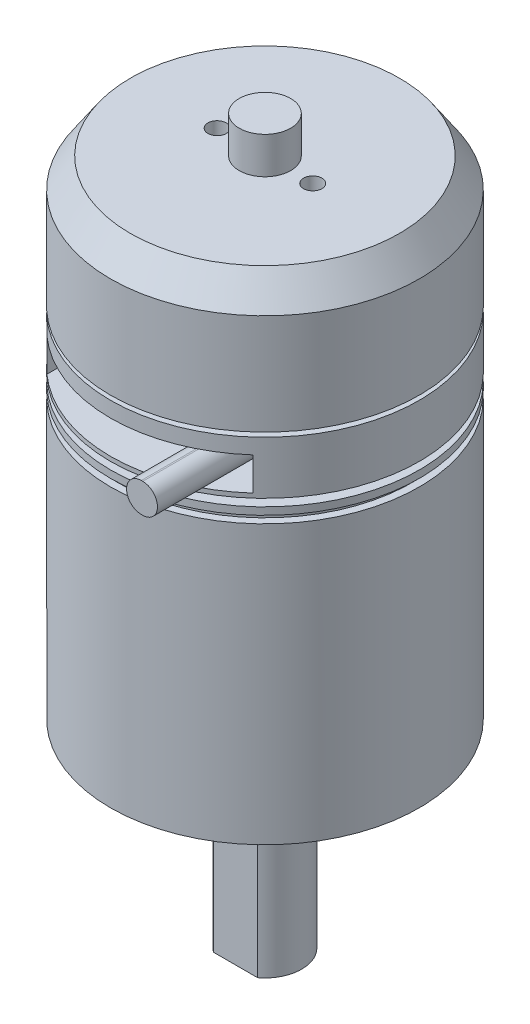
ISO-10303-21;
HEADER;
FILE_DESCRIPTION(('STEP AP214'),'2;1');
FILE_NAME('part.step','',(''),(''),'','','');
FILE_SCHEMA(('AUTOMOTIVE_DESIGN { 1 0 10303 214 1 1 1 1 }'));
ENDSEC;
DATA;
#1=APPLICATION_CONTEXT('core data for automotive mechanical design processes');
#2=APPLICATION_PROTOCOL_DEFINITION('international standard','automotive_design',2000,#1);
#3=PRODUCT_CONTEXT('',#1,'mechanical');
#4=PRODUCT('Part','Part','',(#3));
#5=PRODUCT_RELATED_PRODUCT_CATEGORY('part','',(#4));
#6=PRODUCT_DEFINITION_FORMATION('','',#4);
#7=PRODUCT_DEFINITION_CONTEXT('part definition',#1,'design');
#8=PRODUCT_DEFINITION('design','',#6,#7);
#9=PRODUCT_DEFINITION_SHAPE('','',#8);
#10=(LENGTH_UNIT() NAMED_UNIT(*) SI_UNIT(.MILLI.,.METRE.));
#11=(NAMED_UNIT(*) PLANE_ANGLE_UNIT() SI_UNIT($,.RADIAN.));
#12=(NAMED_UNIT(*) SI_UNIT($,.STERADIAN.) SOLID_ANGLE_UNIT());
#13=UNCERTAINTY_MEASURE_WITH_UNIT(LENGTH_MEASURE(1.E-05),#10,'distance_accuracy_value','');
#14=(GEOMETRIC_REPRESENTATION_CONTEXT(3) GLOBAL_UNCERTAINTY_ASSIGNED_CONTEXT((#13)) GLOBAL_UNIT_ASSIGNED_CONTEXT((#10,
#11,#12)) REPRESENTATION_CONTEXT('',''));
#15=CARTESIAN_POINT('',(0.,0.,0.));
#16=DIRECTION('',(0.,0.,1.));
#17=DIRECTION('',(1.,0.,0.));
#18=AXIS2_PLACEMENT_3D('',#15,#16,#17);
#19=CARTESIAN_POINT('',(0.,0.,11.));
#20=DIRECTION('',(0.,0.,1.));
#21=DIRECTION('',(1.,0.,0.));
#22=AXIS2_PLACEMENT_3D('',#19,#20,#21);
#23=PLANE('',#22);
#24=DIRECTION('',(0.,1.,0.));
#25=VECTOR('',#24,1.);
#26=CARTESIAN_POINT('',(14.,18.3,11.));
#27=LINE('',#26,#25);
#28=CARTESIAN_POINT('',(14.,13.8,11.));
#29=VERTEX_POINT('',#28);
#30=CARTESIAN_POINT('',(14.,18.3,11.));
#31=VERTEX_POINT('',#30);
#32=EDGE_CURVE('E238',#29,#31,#27,.T.);
#33=ORIENTED_EDGE('',*,*,#32,.T.);
#34=DIRECTION('',(-1.,0.,0.));
#35=VECTOR('',#34,1.);
#36=CARTESIAN_POINT('',(-14.,18.3,11.));
#37=LINE('',#36,#35);
#38=CARTESIAN_POINT('',(-14.,18.3,11.));
#39=VERTEX_POINT('',#38);
#40=EDGE_CURVE('E241',#31,#39,#37,.T.);
#41=ORIENTED_EDGE('',*,*,#40,.T.);
#42=DIRECTION('',(0.,-1.,0.));
#43=VECTOR('',#42,1.);
#44=CARTESIAN_POINT('',(-14.,18.3,11.));
#45=LINE('',#44,#43);
#46=CARTESIAN_POINT('',(-14.,13.8,11.));
#47=VERTEX_POINT('',#46);
#48=EDGE_CURVE('E244',#39,#47,#45,.T.);
#49=ORIENTED_EDGE('',*,*,#48,.T.);
#50=DIRECTION('',(1.,0.,0.));
#51=VECTOR('',#50,1.);
#52=CARTESIAN_POINT('',(-14.,13.8,11.));
#53=LINE('',#52,#51);
#54=EDGE_CURVE('E247',#47,#29,#53,.T.);
#55=ORIENTED_EDGE('',*,*,#54,.T.);
#56=EDGE_LOOP('',(#33,#41,#49,#55));
#57=FACE_BOUND('',#56,.T.);
#58=DIRECTION('',(1.,0.,0.));
#59=VECTOR('',#58,1.);
#60=CARTESIAN_POINT('',(9.18505632343501,14.0531944170925,11.));
#61=LINE('',#60,#59);
#62=CARTESIAN_POINT('',(9.18505632343501,14.0531944170925,11.));
#63=VERTEX_POINT('',#62);
#64=CARTESIAN_POINT('',(9.38505632343501,14.0531944170925,11.));
#65=VERTEX_POINT('',#64);
#66=EDGE_CURVE('E225',#63,#65,#61,.T.);
#67=ORIENTED_EDGE('',*,*,#66,.F.);
#68=CARTESIAN_POINT('',(9.18505632343501,16.0531944170925,11.));
#69=DIRECTION('',(0.,0.,1.));
#70=DIRECTION('',(1.,0.,0.));
#71=AXIS2_PLACEMENT_3D('',#68,#69,#70);
#72=CIRCLE('',#71,1.99999999999999);
#73=CARTESIAN_POINT('',(9.18505632343501,18.0531944170925,11.));
#74=VERTEX_POINT('',#73);
#75=EDGE_CURVE('E211',#74,#63,#72,.T.);
#76=ORIENTED_EDGE('',*,*,#75,.F.);
#77=DIRECTION('',(-1.,0.,0.));
#78=VECTOR('',#77,1.);
#79=CARTESIAN_POINT('',(9.18505632343501,18.0531944170925,11.));
#80=LINE('',#79,#78);
#81=CARTESIAN_POINT('',(9.38505632343501,18.0531944170925,11.));
#82=VERTEX_POINT('',#81);
#83=EDGE_CURVE('E216',#82,#74,#80,.T.);
#84=ORIENTED_EDGE('',*,*,#83,.F.);
#85=CARTESIAN_POINT('',(9.38505632343501,16.0531944170925,11.));
#86=DIRECTION('',(0.,0.,1.));
#87=DIRECTION('',(1.,0.,0.));
#88=AXIS2_PLACEMENT_3D('',#85,#86,#87);
#89=CIRCLE('',#88,2.);
#90=EDGE_CURVE('E227',#65,#82,#89,.T.);
#91=ORIENTED_EDGE('',*,*,#90,.F.);
#92=EDGE_LOOP('',(#67,#76,#84,#91));
#93=FACE_BOUND('',#92,.T.);
#94=ADVANCED_FACE('F41',(#57,#93),#23,.T.);
#95=CARTESIAN_POINT('',(0.,43.7,0.));
#96=DIRECTION('',(0.,1.,0.));
#97=DIRECTION('',(0.,0.,1.));
#98=AXIS2_PLACEMENT_3D('',#95,#96,#97);
#99=CYLINDRICAL_SURFACE('',#98,21.);
#100=CARTESIAN_POINT('',(0.,10.2,0.));
#101=DIRECTION('',(0.,1.,0.));
#102=DIRECTION('',(0.,0.,1.));
#103=AXIS2_PLACEMENT_3D('',#100,#101,#102);
#104=CIRCLE('',#103,21.);
#105=CARTESIAN_POINT('',(0.,10.2,21.));
#106=VERTEX_POINT('',#105);
#107=EDGE_CURVE('E307',#106,#106,#104,.T.);
#108=ORIENTED_EDGE('',*,*,#107,.F.);
#109=EDGE_LOOP('',(#108));
#110=FACE_BOUND('',#109,.T.);
#111=CARTESIAN_POINT('',(0.,-27.6,0.));
#112=DIRECTION('',(0.,1.,0.));
#113=DIRECTION('',(-1.,0.,0.));
#114=AXIS2_PLACEMENT_3D('',#111,#112,#113);
#115=CIRCLE('',#114,21.);
#116=CARTESIAN_POINT('',(-21.,-27.6,0.));
#117=VERTEX_POINT('',#116);
#118=EDGE_CURVE('E177',#117,#117,#115,.T.);
#119=ORIENTED_EDGE('',*,*,#118,.T.);
#120=EDGE_LOOP('',(#119));
#121=FACE_BOUND('',#120,.T.);
#122=ADVANCED_FACE('F43',(#110,#121),#99,.T.);
#123=CARTESIAN_POINT('',(21.,10.2,0.));
#124=DIRECTION('',(0.,-1.,0.));
#125=DIRECTION('',(0.,0.,-1.));
#126=AXIS2_PLACEMENT_3D('',#123,#124,#125);
#127=PLANE('',#126);
#128=CARTESIAN_POINT('',(0.,10.2,0.));
#129=DIRECTION('',(0.,1.,0.));
#130=DIRECTION('',(0.,0.,1.));
#131=AXIS2_PLACEMENT_3D('',#128,#129,#130);
#132=CIRCLE('',#131,20.);
#133=CARTESIAN_POINT('',(0.,10.2,20.));
#134=VERTEX_POINT('',#133);
#135=EDGE_CURVE('E304',#134,#134,#132,.T.);
#136=ORIENTED_EDGE('',*,*,#135,.F.);
#137=EDGE_LOOP('',(#136));
#138=FACE_BOUND('',#137,.T.);
#139=ORIENTED_EDGE('',*,*,#107,.T.);
#140=EDGE_LOOP('',(#139));
#141=FACE_BOUND('',#140,.T.);
#142=ADVANCED_FACE('F350',(#138,#141),#127,.F.);
#143=CARTESIAN_POINT('',(0.,43.7,0.));
#144=DIRECTION('',(0.,1.,0.));
#145=DIRECTION('',(0.,0.,1.));
#146=AXIS2_PLACEMENT_3D('',#143,#144,#145);
#147=CYLINDRICAL_SURFACE('',#146,20.);
#148=CARTESIAN_POINT('',(0.,11.2,0.));
#149=DIRECTION('',(0.,1.,0.));
#150=DIRECTION('',(0.,0.,1.));
#151=AXIS2_PLACEMENT_3D('',#148,#149,#150);
#152=CIRCLE('',#151,20.);
#153=CARTESIAN_POINT('',(0.,11.2,20.));
#154=VERTEX_POINT('',#153);
#155=EDGE_CURVE('E301',#154,#154,#152,.T.);
#156=ORIENTED_EDGE('',*,*,#155,.F.);
#157=EDGE_LOOP('',(#156));
#158=FACE_BOUND('',#157,.T.);
#159=ORIENTED_EDGE('',*,*,#135,.T.);
#160=EDGE_LOOP('',(#159));
#161=FACE_BOUND('',#160,.T.);
#162=ADVANCED_FACE('F414',(#158,#161),#147,.T.);
#163=CARTESIAN_POINT('',(20.,11.2,0.));
#164=DIRECTION('',(0.,1.,0.));
#165=DIRECTION('',(0.,0.,1.));
#166=AXIS2_PLACEMENT_3D('',#163,#164,#165);
#167=PLANE('',#166);
#168=CARTESIAN_POINT('',(0.,11.2,0.));
#169=DIRECTION('',(0.,1.,0.));
#170=DIRECTION('',(0.,0.,1.));
#171=AXIS2_PLACEMENT_3D('',#168,#169,#170);
#172=CIRCLE('',#171,21.);
#173=CARTESIAN_POINT('',(0.,11.2,21.));
#174=VERTEX_POINT('',#173);
#175=EDGE_CURVE('E298',#174,#174,#172,.T.);
#176=ORIENTED_EDGE('',*,*,#175,.F.);
#177=EDGE_LOOP('',(#176));
#178=FACE_BOUND('',#177,.T.);
#179=ORIENTED_EDGE('',*,*,#155,.T.);
#180=EDGE_LOOP('',(#179));
#181=FACE_BOUND('',#180,.T.);
#182=ADVANCED_FACE('F410',(#178,#181),#167,.F.);
#183=CARTESIAN_POINT('',(0.,43.7,0.));
#184=DIRECTION('',(0.,1.,0.));
#185=DIRECTION('',(0.,0.,1.));
#186=AXIS2_PLACEMENT_3D('',#183,#184,#185);
#187=CYLINDRICAL_SURFACE('',#186,21.);
#188=CARTESIAN_POINT('',(0.,12.2,0.));
#189=DIRECTION('',(0.,1.,0.));
#190=DIRECTION('',(0.,0.,1.));
#191=AXIS2_PLACEMENT_3D('',#188,#189,#190);
#192=CIRCLE('',#191,21.);
#193=CARTESIAN_POINT('',(0.,12.2,21.));
#194=VERTEX_POINT('',#193);
#195=EDGE_CURVE('E295',#194,#194,#192,.T.);
#196=ORIENTED_EDGE('',*,*,#195,.F.);
#197=EDGE_LOOP('',(#196));
#198=FACE_BOUND('',#197,.T.);
#199=ORIENTED_EDGE('',*,*,#175,.T.);
#200=EDGE_LOOP('',(#199));
#201=FACE_BOUND('',#200,.T.);
#202=ADVANCED_FACE('F406',(#198,#201),#187,.T.);
#203=CARTESIAN_POINT('',(21.,12.2,0.));
#204=DIRECTION('',(0.,-1.,0.));
#205=DIRECTION('',(0.,0.,-1.));
#206=AXIS2_PLACEMENT_3D('',#203,#204,#205);
#207=PLANE('',#206);
#208=CARTESIAN_POINT('',(0.,12.2,0.));
#209=DIRECTION('',(0.,1.,0.));
#210=DIRECTION('',(0.,0.,1.));
#211=AXIS2_PLACEMENT_3D('',#208,#209,#210);
#212=CIRCLE('',#211,10.);
#213=CARTESIAN_POINT('',(0.,12.2,10.));
#214=VERTEX_POINT('',#213);
#215=EDGE_CURVE('E292',#214,#214,#212,.T.);
#216=ORIENTED_EDGE('',*,*,#215,.F.);
#217=EDGE_LOOP('',(#216));
#218=FACE_BOUND('',#217,.T.);
#219=ORIENTED_EDGE('',*,*,#195,.T.);
#220=EDGE_LOOP('',(#219));
#221=FACE_BOUND('',#220,.T.);
#222=ADVANCED_FACE('F402',(#218,#221),#207,.F.);
#223=CARTESIAN_POINT('',(0.,43.7,0.));
#224=DIRECTION('',(0.,1.,0.));
#225=DIRECTION('',(0.,0.,1.));
#226=AXIS2_PLACEMENT_3D('',#223,#224,#225);
#227=CYLINDRICAL_SURFACE('',#226,10.);
#228=CARTESIAN_POINT('',(0.,13.2,0.));
#229=DIRECTION('',(0.,1.,0.));
#230=DIRECTION('',(0.,0.,1.));
#231=AXIS2_PLACEMENT_3D('',#228,#229,#230);
#232=CIRCLE('',#231,10.);
#233=CARTESIAN_POINT('',(0.,13.2,10.));
#234=VERTEX_POINT('',#233);
#235=EDGE_CURVE('E289',#234,#234,#232,.T.);
#236=ORIENTED_EDGE('',*,*,#235,.F.);
#237=EDGE_LOOP('',(#236));
#238=FACE_BOUND('',#237,.T.);
#239=ORIENTED_EDGE('',*,*,#215,.T.);
#240=EDGE_LOOP('',(#239));
#241=FACE_BOUND('',#240,.T.);
#242=ADVANCED_FACE('F398',(#238,#241),#227,.T.);
#243=CARTESIAN_POINT('',(10.,13.2,0.));
#244=DIRECTION('',(0.,1.,0.));
#245=DIRECTION('',(0.,0.,1.));
#246=AXIS2_PLACEMENT_3D('',#243,#244,#245);
#247=PLANE('',#246);
#248=CARTESIAN_POINT('',(0.,13.2,0.));
#249=DIRECTION('',(0.,1.,0.));
#250=DIRECTION('',(0.,0.,1.));
#251=AXIS2_PLACEMENT_3D('',#248,#249,#250);
#252=CIRCLE('',#251,21.);
#253=CARTESIAN_POINT('',(0.,13.2,21.));
#254=VERTEX_POINT('',#253);
#255=EDGE_CURVE('E286',#254,#254,#252,.T.);
#256=ORIENTED_EDGE('',*,*,#255,.F.);
#257=EDGE_LOOP('',(#256));
#258=FACE_BOUND('',#257,.T.);
#259=ORIENTED_EDGE('',*,*,#235,.T.);
#260=EDGE_LOOP('',(#259));
#261=FACE_BOUND('',#260,.T.);
#262=ADVANCED_FACE('F395',(#258,#261),#247,.F.);
#263=CARTESIAN_POINT('',(0.,43.7,0.));
#264=DIRECTION('',(0.,1.,0.));
#265=DIRECTION('',(0.,0.,1.));
#266=AXIS2_PLACEMENT_3D('',#263,#264,#265);
#267=CYLINDRICAL_SURFACE('',#266,21.);
#268=CARTESIAN_POINT('',(0.,18.3,0.));
#269=DIRECTION('',(0.,1.,0.));
#270=DIRECTION('',(0.,0.,1.));
#271=AXIS2_PLACEMENT_3D('',#268,#269,#270);
#272=CIRCLE('',#271,21.);
#273=CARTESIAN_POINT('',(-14.,18.3,15.6524758424985));
#274=VERTEX_POINT('',#273);
#275=CARTESIAN_POINT('',(14.,18.3,15.6524758424985));
#276=VERTEX_POINT('',#275);
#277=EDGE_CURVE('E310',#274,#276,#272,.T.);
#278=ORIENTED_EDGE('',*,*,#277,.T.);
#279=DIRECTION('',(0.,1.,0.));
#280=VECTOR('',#279,1.);
#281=CARTESIAN_POINT('',(14.,43.7,15.6524758424985));
#282=LINE('',#281,#280);
#283=CARTESIAN_POINT('',(14.,13.8,15.6524758424985));
#284=VERTEX_POINT('',#283);
#285=EDGE_CURVE('E11',#276,#284,#282,.F.);
#286=ORIENTED_EDGE('',*,*,#285,.T.);
#287=CARTESIAN_POINT('',(0.,13.8,0.));
#288=DIRECTION('',(0.,-1.,0.));
#289=DIRECTION('',(0.,0.,-1.));
#290=AXIS2_PLACEMENT_3D('',#287,#288,#289);
#291=CIRCLE('',#290,21.);
#292=CARTESIAN_POINT('',(-14.,13.8,15.6524758424985));
#293=VERTEX_POINT('',#292);
#294=EDGE_CURVE('E49',#284,#293,#291,.T.);
#295=ORIENTED_EDGE('',*,*,#294,.T.);
#296=DIRECTION('',(0.,1.,0.));
#297=VECTOR('',#296,1.);
#298=CARTESIAN_POINT('',(-14.,43.7,15.6524758424985));
#299=LINE('',#298,#297);
#300=EDGE_CURVE('E312',#293,#274,#299,.T.);
#301=ORIENTED_EDGE('',*,*,#300,.T.);
#302=EDGE_LOOP('',(#278,#286,#295,#301));
#303=FACE_BOUND('',#302,.T.);
#304=CARTESIAN_POINT('',(0.,20.4,0.));
#305=DIRECTION('',(0.,1.,0.));
#306=DIRECTION('',(0.,0.,1.));
#307=AXIS2_PLACEMENT_3D('',#304,#305,#306);
#308=CIRCLE('',#307,21.);
#309=CARTESIAN_POINT('',(0.,20.4,21.));
#310=VERTEX_POINT('',#309);
#311=EDGE_CURVE('E283',#310,#310,#308,.T.);
#312=ORIENTED_EDGE('',*,*,#311,.F.);
#313=EDGE_LOOP('',(#312));
#314=FACE_BOUND('',#313,.T.);
#315=ORIENTED_EDGE('',*,*,#255,.T.);
#316=EDGE_LOOP('',(#315));
#317=FACE_BOUND('',#316,.T.);
#318=ADVANCED_FACE('F316',(#303,#314,#317),#267,.T.);
#319=CARTESIAN_POINT('',(21.,20.4,0.));
#320=DIRECTION('',(0.,-1.,0.));
#321=DIRECTION('',(0.,0.,-1.));
#322=AXIS2_PLACEMENT_3D('',#319,#320,#321);
#323=PLANE('',#322);
#324=CARTESIAN_POINT('',(0.,20.4,0.));
#325=DIRECTION('',(0.,1.,0.));
#326=DIRECTION('',(0.,0.,1.));
#327=AXIS2_PLACEMENT_3D('',#324,#325,#326);
#328=CIRCLE('',#327,5.);
#329=CARTESIAN_POINT('',(0.,20.4,5.));
#330=VERTEX_POINT('',#329);
#331=EDGE_CURVE('E280',#330,#330,#328,.T.);
#332=ORIENTED_EDGE('',*,*,#331,.F.);
#333=EDGE_LOOP('',(#332));
#334=FACE_BOUND('',#333,.T.);
#335=ORIENTED_EDGE('',*,*,#311,.T.);
#336=EDGE_LOOP('',(#335));
#337=FACE_BOUND('',#336,.T.);
#338=ADVANCED_FACE('F388',(#334,#337),#323,.F.);
#339=CARTESIAN_POINT('',(0.,43.7,0.));
#340=DIRECTION('',(0.,1.,0.));
#341=DIRECTION('',(0.,0.,1.));
#342=AXIS2_PLACEMENT_3D('',#339,#340,#341);
#343=CYLINDRICAL_SURFACE('',#342,5.);
#344=CARTESIAN_POINT('',(0.,21.,0.));
#345=DIRECTION('',(0.,1.,0.));
#346=DIRECTION('',(0.,0.,1.));
#347=AXIS2_PLACEMENT_3D('',#344,#345,#346);
#348=CIRCLE('',#347,5.);
#349=CARTESIAN_POINT('',(0.,21.,5.));
#350=VERTEX_POINT('',#349);
#351=EDGE_CURVE('E277',#350,#350,#348,.T.);
#352=ORIENTED_EDGE('',*,*,#351,.F.);
#353=EDGE_LOOP('',(#352));
#354=FACE_BOUND('',#353,.T.);
#355=ORIENTED_EDGE('',*,*,#331,.T.);
#356=EDGE_LOOP('',(#355));
#357=FACE_BOUND('',#356,.T.);
#358=ADVANCED_FACE('F384',(#354,#357),#343,.T.);
#359=CARTESIAN_POINT('',(5.,21.,0.));
#360=DIRECTION('',(0.,1.,0.));
#361=DIRECTION('',(0.,0.,1.));
#362=AXIS2_PLACEMENT_3D('',#359,#360,#361);
#363=PLANE('',#362);
#364=CARTESIAN_POINT('',(0.,21.,0.));
#365=DIRECTION('',(0.,1.,0.));
#366=DIRECTION('',(0.,0.,1.));
#367=AXIS2_PLACEMENT_3D('',#364,#365,#366);
#368=CIRCLE('',#367,21.);
#369=CARTESIAN_POINT('',(0.,21.,21.));
#370=VERTEX_POINT('',#369);
#371=EDGE_CURVE('E274',#370,#370,#368,.T.);
#372=ORIENTED_EDGE('',*,*,#371,.F.);
#373=EDGE_LOOP('',(#372));
#374=FACE_BOUND('',#373,.T.);
#375=ORIENTED_EDGE('',*,*,#351,.T.);
#376=EDGE_LOOP('',(#375));
#377=FACE_BOUND('',#376,.T.);
#378=ADVANCED_FACE('F380',(#374,#377),#363,.F.);
#379=CARTESIAN_POINT('',(0.,43.7,0.));
#380=DIRECTION('',(0.,1.,0.));
#381=DIRECTION('',(0.,0.,1.));
#382=AXIS2_PLACEMENT_3D('',#379,#380,#381);
#383=CYLINDRICAL_SURFACE('',#382,21.);
#384=CARTESIAN_POINT('',(0.,34.7,0.));
#385=DIRECTION('',(0.,1.,0.));
#386=DIRECTION('',(0.,0.,1.));
#387=AXIS2_PLACEMENT_3D('',#384,#385,#386);
#388=CIRCLE('',#387,21.);
#389=CARTESIAN_POINT('',(0.,34.7,21.));
#390=VERTEX_POINT('',#389);
#391=EDGE_CURVE('E271',#390,#390,#388,.T.);
#392=ORIENTED_EDGE('',*,*,#391,.F.);
#393=EDGE_LOOP('',(#392));
#394=FACE_BOUND('',#393,.T.);
#395=ORIENTED_EDGE('',*,*,#371,.T.);
#396=EDGE_LOOP('',(#395));
#397=FACE_BOUND('',#396,.T.);
#398=ADVANCED_FACE('F376',(#394,#397),#383,.T.);
#399=CARTESIAN_POINT('',(0.,34.7,0.));
#400=DIRECTION('',(0.,-1.,0.));
#401=DIRECTION('',(0.,0.,-1.));
#402=AXIS2_PLACEMENT_3D('',#399,#400,#401);
#403=CONICAL_SURFACE('',#402,21.,0.593749666710772);
#404=CARTESIAN_POINT('',(0.,38.7,0.));
#405=DIRECTION('',(0.,1.,0.));
#406=DIRECTION('',(0.,0.,1.));
#407=AXIS2_PLACEMENT_3D('',#404,#405,#406);
#408=CIRCLE('',#407,18.3);
#409=CARTESIAN_POINT('',(0.,38.7,18.3));
#410=VERTEX_POINT('',#409);
#411=EDGE_CURVE('E268',#410,#410,#408,.T.);
#412=ORIENTED_EDGE('',*,*,#411,.F.);
#413=EDGE_LOOP('',(#412));
#414=FACE_BOUND('',#413,.T.);
#415=ORIENTED_EDGE('',*,*,#391,.T.);
#416=EDGE_LOOP('',(#415));
#417=FACE_BOUND('',#416,.T.);
#418=ADVANCED_FACE('F372',(#414,#417),#403,.T.);
#419=CARTESIAN_POINT('',(18.3,38.7,0.));
#420=DIRECTION('',(0.,-1.,0.));
#421=DIRECTION('',(0.,0.,-1.));
#422=AXIS2_PLACEMENT_3D('',#419,#420,#421);
#423=PLANE('',#422);
#424=CARTESIAN_POINT('',(-6.5,38.7,0.));
#425=DIRECTION('',(0.,1.,0.));
#426=DIRECTION('',(0.,0.,1.));
#427=AXIS2_PLACEMENT_3D('',#424,#425,#426);
#428=CIRCLE('',#427,1.24999999999999);
#429=CARTESIAN_POINT('',(-6.5,38.7,1.24999999999999));
#430=VERTEX_POINT('',#429);
#431=EDGE_CURVE('E199',#430,#430,#428,.T.);
#432=ORIENTED_EDGE('',*,*,#431,.F.);
#433=EDGE_LOOP('',(#432));
#434=FACE_BOUND('',#433,.T.);
#435=CARTESIAN_POINT('',(6.5,38.7,0.));
#436=DIRECTION('',(0.,1.,0.));
#437=DIRECTION('',(0.,0.,1.));
#438=AXIS2_PLACEMENT_3D('',#435,#436,#437);
#439=CIRCLE('',#438,1.24999999999999);
#440=CARTESIAN_POINT('',(6.5,38.7,1.24999999999999));
#441=VERTEX_POINT('',#440);
#442=EDGE_CURVE('E205',#441,#441,#439,.T.);
#443=ORIENTED_EDGE('',*,*,#442,.F.);
#444=EDGE_LOOP('',(#443));
#445=FACE_BOUND('',#444,.T.);
#446=CARTESIAN_POINT('',(0.,38.7,0.));
#447=DIRECTION('',(0.,1.,0.));
#448=DIRECTION('',(0.,0.,1.));
#449=AXIS2_PLACEMENT_3D('',#446,#447,#448);
#450=CIRCLE('',#449,3.5);
#451=CARTESIAN_POINT('',(0.,38.7,3.5));
#452=VERTEX_POINT('',#451);
#453=EDGE_CURVE('E265',#452,#452,#450,.T.);
#454=ORIENTED_EDGE('',*,*,#453,.F.);
#455=EDGE_LOOP('',(#454));
#456=FACE_BOUND('',#455,.T.);
#457=ORIENTED_EDGE('',*,*,#411,.T.);
#458=EDGE_LOOP('',(#457));
#459=FACE_BOUND('',#458,.T.);
#460=ADVANCED_FACE('F368',(#434,#445,#456,#459),#423,.F.);
#461=CARTESIAN_POINT('',(0.,43.7,0.));
#462=DIRECTION('',(0.,1.,0.));
#463=DIRECTION('',(0.,0.,1.));
#464=AXIS2_PLACEMENT_3D('',#461,#462,#463);
#465=CYLINDRICAL_SURFACE('',#464,3.5);
#466=CARTESIAN_POINT('',(0.,43.7,0.));
#467=DIRECTION('',(0.,1.,0.));
#468=DIRECTION('',(0.,0.,1.));
#469=AXIS2_PLACEMENT_3D('',#466,#467,#468);
#470=CIRCLE('',#469,3.5);
#471=CARTESIAN_POINT('',(0.,43.7,3.5));
#472=VERTEX_POINT('',#471);
#473=EDGE_CURVE('E254',#472,#472,#470,.T.);
#474=ORIENTED_EDGE('',*,*,#473,.F.);
#475=EDGE_LOOP('',(#474));
#476=FACE_BOUND('',#475,.T.);
#477=ORIENTED_EDGE('',*,*,#453,.T.);
#478=EDGE_LOOP('',(#477));
#479=FACE_BOUND('',#478,.T.);
#480=ADVANCED_FACE('F362',(#476,#479),#465,.T.);
#481=CARTESIAN_POINT('',(3.5,43.7,0.));
#482=DIRECTION('',(0.,-1.,0.));
#483=DIRECTION('',(0.,0.,-1.));
#484=AXIS2_PLACEMENT_3D('',#481,#482,#483);
#485=PLANE('',#484);
#486=ORIENTED_EDGE('',*,*,#473,.T.);
#487=EDGE_LOOP('',(#486));
#488=FACE_BOUND('',#487,.T.);
#489=ADVANCED_FACE('F358',(#488),#485,.F.);
#490=CARTESIAN_POINT('',(14.,18.3,11.));
#491=DIRECTION('',(1.,0.,0.));
#492=DIRECTION('',(0.,0.,-1.));
#493=AXIS2_PLACEMENT_3D('',#490,#491,#492);
#494=PLANE('',#493);
#495=DIRECTION('',(0.,0.,1.));
#496=VECTOR('',#495,1.);
#497=CARTESIAN_POINT('',(14.,18.3,11.));
#498=LINE('',#497,#496);
#499=EDGE_CURVE('E250',#31,#276,#498,.T.);
#500=ORIENTED_EDGE('',*,*,#499,.F.);
#501=ORIENTED_EDGE('',*,*,#32,.F.);
#502=DIRECTION('',(0.,0.,1.));
#503=VECTOR('',#502,1.);
#504=CARTESIAN_POINT('',(14.,13.8,11.));
#505=LINE('',#504,#503);
#506=EDGE_CURVE('E251',#29,#284,#505,.T.);
#507=ORIENTED_EDGE('',*,*,#506,.T.);
#508=ORIENTED_EDGE('',*,*,#285,.F.);
#509=EDGE_LOOP('',(#500,#501,#507,#508));
#510=FACE_BOUND('',#509,.T.);
#511=ADVANCED_FACE('F324',(#510),#494,.F.);
#512=CARTESIAN_POINT('',(-14.,13.8,11.));
#513=DIRECTION('',(0.,-1.,0.));
#514=DIRECTION('',(0.,0.,-1.));
#515=AXIS2_PLACEMENT_3D('',#512,#513,#514);
#516=PLANE('',#515);
#517=ORIENTED_EDGE('',*,*,#506,.F.);
#518=ORIENTED_EDGE('',*,*,#54,.F.);
#519=DIRECTION('',(0.,0.,1.));
#520=VECTOR('',#519,1.);
#521=CARTESIAN_POINT('',(-14.,13.8,11.));
#522=LINE('',#521,#520);
#523=EDGE_CURVE('E255',#47,#293,#522,.T.);
#524=ORIENTED_EDGE('',*,*,#523,.T.);
#525=ORIENTED_EDGE('',*,*,#294,.F.);
#526=EDGE_LOOP('',(#517,#518,#524,#525));
#527=FACE_BOUND('',#526,.T.);
#528=ADVANCED_FACE('F320',(#527),#516,.F.);
#529=CARTESIAN_POINT('',(-14.,18.3,11.));
#530=DIRECTION('',(-1.,0.,0.));
#531=DIRECTION('',(0.,-1.,0.));
#532=AXIS2_PLACEMENT_3D('',#529,#530,#531);
#533=PLANE('',#532);
#534=ORIENTED_EDGE('',*,*,#523,.F.);
#535=ORIENTED_EDGE('',*,*,#48,.F.);
#536=DIRECTION('',(0.,0.,1.));
#537=VECTOR('',#536,1.);
#538=CARTESIAN_POINT('',(-14.,18.3,11.));
#539=LINE('',#538,#537);
#540=EDGE_CURVE('E258',#39,#274,#539,.T.);
#541=ORIENTED_EDGE('',*,*,#540,.T.);
#542=ORIENTED_EDGE('',*,*,#300,.F.);
#543=EDGE_LOOP('',(#534,#535,#541,#542));
#544=FACE_BOUND('',#543,.T.);
#545=ADVANCED_FACE('F330',(#544),#533,.F.);
#546=CARTESIAN_POINT('',(-14.,18.3,11.));
#547=DIRECTION('',(0.,1.,0.));
#548=DIRECTION('',(0.,0.,1.));
#549=AXIS2_PLACEMENT_3D('',#546,#547,#548);
#550=PLANE('',#549);
#551=ORIENTED_EDGE('',*,*,#277,.F.);
#552=ORIENTED_EDGE('',*,*,#540,.F.);
#553=ORIENTED_EDGE('',*,*,#40,.F.);
#554=ORIENTED_EDGE('',*,*,#499,.T.);
#555=EDGE_LOOP('',(#551,#552,#553,#554));
#556=FACE_BOUND('',#555,.T.);
#557=ADVANCED_FACE('F332',(#556),#550,.F.);
#558=CARTESIAN_POINT('',(9.18505632343501,16.0531944170925,26.));
#559=DIRECTION('',(0.,0.,-1.));
#560=DIRECTION('',(-1.,0.,0.));
#561=AXIS2_PLACEMENT_3D('',#558,#559,#560);
#562=CYLINDRICAL_SURFACE('',#561,1.99999999999999);
#563=ORIENTED_EDGE('',*,*,#75,.T.);
#564=DIRECTION('',(0.,0.,-1.));
#565=VECTOR('',#564,1.);
#566=CARTESIAN_POINT('',(9.18505632343501,14.0531944170925,26.));
#567=LINE('',#566,#565);
#568=CARTESIAN_POINT('',(9.18505632343501,14.0531944170925,26.));
#569=VERTEX_POINT('',#568);
#570=EDGE_CURVE('E236',#569,#63,#567,.T.);
#571=ORIENTED_EDGE('',*,*,#570,.F.);
#572=CARTESIAN_POINT('',(9.18505632343501,16.0531944170925,26.));
#573=DIRECTION('',(0.,0.,1.));
#574=DIRECTION('',(1.,0.,0.));
#575=AXIS2_PLACEMENT_3D('',#572,#573,#574);
#576=CIRCLE('',#575,1.99999999999999);
#577=CARTESIAN_POINT('',(9.18505632343501,18.0531944170925,26.));
#578=VERTEX_POINT('',#577);
#579=EDGE_CURVE('E212',#578,#569,#576,.T.);
#580=ORIENTED_EDGE('',*,*,#579,.F.);
#581=DIRECTION('',(0.,0.,-1.));
#582=VECTOR('',#581,1.);
#583=CARTESIAN_POINT('',(9.18505632343501,18.0531944170925,26.));
#584=LINE('',#583,#582);
#585=EDGE_CURVE('E222',#578,#74,#584,.T.);
#586=ORIENTED_EDGE('',*,*,#585,.T.);
#587=EDGE_LOOP('',(#563,#571,#580,#586));
#588=FACE_BOUND('',#587,.T.);
#589=ADVANCED_FACE('F334',(#588),#562,.T.);
#590=CARTESIAN_POINT('',(9.18505632343501,14.0531944170925,26.));
#591=DIRECTION('',(0.,1.,0.));
#592=DIRECTION('',(-1.,0.,0.));
#593=AXIS2_PLACEMENT_3D('',#590,#591,#592);
#594=PLANE('',#593);
#595=ORIENTED_EDGE('',*,*,#66,.T.);
#596=DIRECTION('',(0.,0.,-1.));
#597=VECTOR('',#596,1.);
#598=CARTESIAN_POINT('',(9.38505632343501,14.0531944170925,26.));
#599=LINE('',#598,#597);
#600=CARTESIAN_POINT('',(9.38505632343501,14.0531944170925,26.));
#601=VERTEX_POINT('',#600);
#602=EDGE_CURVE('E233',#601,#65,#599,.T.);
#603=ORIENTED_EDGE('',*,*,#602,.F.);
#604=DIRECTION('',(1.,0.,0.));
#605=VECTOR('',#604,1.);
#606=CARTESIAN_POINT('',(9.18505632343501,14.0531944170925,26.));
#607=LINE('',#606,#605);
#608=EDGE_CURVE('E215',#569,#601,#607,.T.);
#609=ORIENTED_EDGE('',*,*,#608,.F.);
#610=ORIENTED_EDGE('',*,*,#570,.T.);
#611=EDGE_LOOP('',(#595,#603,#609,#610));
#612=FACE_BOUND('',#611,.T.);
#613=ADVANCED_FACE('F340',(#612),#594,.F.);
#614=CARTESIAN_POINT('',(9.38505632343501,16.0531944170925,26.));
#615=DIRECTION('',(0.,0.,-1.));
#616=DIRECTION('',(-1.,0.,0.));
#617=AXIS2_PLACEMENT_3D('',#614,#615,#616);
#618=CYLINDRICAL_SURFACE('',#617,2.);
#619=ORIENTED_EDGE('',*,*,#90,.T.);
#620=DIRECTION('',(0.,0.,-1.));
#621=VECTOR('',#620,1.);
#622=CARTESIAN_POINT('',(9.38505632343501,18.0531944170925,26.));
#623=LINE('',#622,#621);
#624=CARTESIAN_POINT('',(9.38505632343501,18.0531944170925,26.));
#625=VERTEX_POINT('',#624);
#626=EDGE_CURVE('E63',#625,#82,#623,.T.);
#627=ORIENTED_EDGE('',*,*,#626,.F.);
#628=CARTESIAN_POINT('',(9.38505632343501,16.0531944170925,26.));
#629=DIRECTION('',(0.,0.,1.));
#630=DIRECTION('',(1.,0.,0.));
#631=AXIS2_PLACEMENT_3D('',#628,#629,#630);
#632=CIRCLE('',#631,2.);
#633=EDGE_CURVE('E218',#601,#625,#632,.T.);
#634=ORIENTED_EDGE('',*,*,#633,.F.);
#635=ORIENTED_EDGE('',*,*,#602,.T.);
#636=EDGE_LOOP('',(#619,#627,#634,#635));
#637=FACE_BOUND('',#636,.T.);
#638=ADVANCED_FACE('F494',(#637),#618,.T.);
#639=CARTESIAN_POINT('',(9.18505632343501,18.0531944170925,26.));
#640=DIRECTION('',(0.,-1.,0.));
#641=DIRECTION('',(1.,0.,0.));
#642=AXIS2_PLACEMENT_3D('',#639,#640,#641);
#643=PLANE('',#642);
#644=ORIENTED_EDGE('',*,*,#83,.T.);
#645=ORIENTED_EDGE('',*,*,#585,.F.);
#646=DIRECTION('',(-1.,0.,0.));
#647=VECTOR('',#646,1.);
#648=CARTESIAN_POINT('',(9.18505632343501,18.0531944170925,26.));
#649=LINE('',#648,#647);
#650=EDGE_CURVE('E220',#625,#578,#649,.T.);
#651=ORIENTED_EDGE('',*,*,#650,.F.);
#652=ORIENTED_EDGE('',*,*,#626,.T.);
#653=EDGE_LOOP('',(#644,#645,#651,#652));
#654=FACE_BOUND('',#653,.T.);
#655=ADVANCED_FACE('F490',(#654),#643,.F.);
#656=CARTESIAN_POINT('',(9.18505632343501,16.0531944170925,26.));
#657=DIRECTION('',(0.,0.,1.));
#658=DIRECTION('',(1.,0.,0.));
#659=AXIS2_PLACEMENT_3D('',#656,#657,#658);
#660=PLANE('',#659);
#661=ORIENTED_EDGE('',*,*,#579,.T.);
#662=ORIENTED_EDGE('',*,*,#608,.T.);
#663=ORIENTED_EDGE('',*,*,#633,.T.);
#664=ORIENTED_EDGE('',*,*,#650,.T.);
#665=EDGE_LOOP('',(#661,#662,#663,#664));
#666=FACE_BOUND('',#665,.T.);
#667=ADVANCED_FACE('F486',(#666),#660,.T.);
#668=CARTESIAN_POINT('',(6.5,34.7,0.));
#669=DIRECTION('',(0.,1.,0.));
#670=DIRECTION('',(0.,0.,1.));
#671=AXIS2_PLACEMENT_3D('',#668,#669,#670);
#672=CONICAL_SURFACE('',#671,1.25,1.02974425867665);
#673=CARTESIAN_POINT('',(6.5,33.9489242262155,0.));
#674=VERTEX_POINT('',#673);
#675=VERTEX_LOOP('',#674);
#676=FACE_BOUND('',#675,.T.);
#677=CARTESIAN_POINT('',(6.5,34.7,0.));
#678=DIRECTION('',(0.,1.,0.));
#679=DIRECTION('',(0.,0.,1.));
#680=AXIS2_PLACEMENT_3D('',#677,#678,#679);
#681=CIRCLE('',#680,1.25);
#682=CARTESIAN_POINT('',(6.5,34.7,1.25));
#683=VERTEX_POINT('',#682);
#684=EDGE_CURVE('E208',#683,#683,#681,.T.);
#685=ORIENTED_EDGE('',*,*,#684,.T.);
#686=EDGE_LOOP('',(#685));
#687=FACE_BOUND('',#686,.T.);
#688=ADVANCED_FACE('F482',(#676,#687),#672,.F.);
#689=CARTESIAN_POINT('',(6.5,38.7,0.));
#690=DIRECTION('',(0.,1.,0.));
#691=DIRECTION('',(0.,0.,1.));
#692=AXIS2_PLACEMENT_3D('',#689,#690,#691);
#693=CYLINDRICAL_SURFACE('',#692,1.24999999999999);
#694=ORIENTED_EDGE('',*,*,#684,.F.);
#695=EDGE_LOOP('',(#694));
#696=FACE_BOUND('',#695,.T.);
#697=ORIENTED_EDGE('',*,*,#442,.T.);
#698=EDGE_LOOP('',(#697));
#699=FACE_BOUND('',#698,.T.);
#700=ADVANCED_FACE('F478',(#696,#699),#693,.F.);
#701=CARTESIAN_POINT('',(-6.5,34.7,0.));
#702=DIRECTION('',(0.,1.,0.));
#703=DIRECTION('',(0.,0.,1.));
#704=AXIS2_PLACEMENT_3D('',#701,#702,#703);
#705=CONICAL_SURFACE('',#704,1.25,1.02974425867665);
#706=CARTESIAN_POINT('',(-6.5,33.9489242262155,0.));
#707=VERTEX_POINT('',#706);
#708=VERTEX_LOOP('',#707);
#709=FACE_BOUND('',#708,.T.);
#710=CARTESIAN_POINT('',(-6.5,34.7,0.));
#711=DIRECTION('',(0.,1.,0.));
#712=DIRECTION('',(0.,0.,1.));
#713=AXIS2_PLACEMENT_3D('',#710,#711,#712);
#714=CIRCLE('',#713,1.25);
#715=CARTESIAN_POINT('',(-6.5,34.7,1.25));
#716=VERTEX_POINT('',#715);
#717=EDGE_CURVE('E202',#716,#716,#714,.T.);
#718=ORIENTED_EDGE('',*,*,#717,.T.);
#719=EDGE_LOOP('',(#718));
#720=FACE_BOUND('',#719,.T.);
#721=ADVANCED_FACE('F474',(#709,#720),#705,.F.);
#722=CARTESIAN_POINT('',(-6.5,38.7,0.));
#723=DIRECTION('',(0.,1.,0.));
#724=DIRECTION('',(0.,0.,1.));
#725=AXIS2_PLACEMENT_3D('',#722,#723,#724);
#726=CYLINDRICAL_SURFACE('',#725,1.24999999999999);
#727=ORIENTED_EDGE('',*,*,#717,.F.);
#728=EDGE_LOOP('',(#727));
#729=FACE_BOUND('',#728,.T.);
#730=ORIENTED_EDGE('',*,*,#431,.T.);
#731=EDGE_LOOP('',(#730));
#732=FACE_BOUND('',#731,.T.);
#733=ADVANCED_FACE('F468',(#729,#732),#726,.F.);
#734=CARTESIAN_POINT('',(0.,-54.6,0.));
#735=DIRECTION('',(0.,1.,0.));
#736=DIRECTION('',(-1.,0.,0.));
#737=AXIS2_PLACEMENT_3D('',#734,#735,#736);
#738=PLANE('',#737);
#739=CARTESIAN_POINT('',(0.,-54.6,0.));
#740=DIRECTION('',(0.,1.,0.));
#741=DIRECTION('',(-1.,0.,0.));
#742=AXIS2_PLACEMENT_3D('',#739,#740,#741);
#743=CIRCLE('',#742,5.);
#744=CARTESIAN_POINT('',(3.00000000000002,-54.6,4.));
#745=VERTEX_POINT('',#744);
#746=CARTESIAN_POINT('',(-3.,-54.6,4.));
#747=VERTEX_POINT('',#746);
#748=EDGE_CURVE('E196',#745,#747,#743,.T.);
#749=ORIENTED_EDGE('',*,*,#748,.F.);
#750=DIRECTION('',(1.,0.,0.));
#751=VECTOR('',#750,1.);
#752=CARTESIAN_POINT('',(-3.,-54.6,4.));
#753=LINE('',#752,#751);
#754=EDGE_CURVE('E168',#747,#745,#753,.T.);
#755=ORIENTED_EDGE('',*,*,#754,.F.);
#756=EDGE_LOOP('',(#749,#755));
#757=FACE_BOUND('',#756,.T.);
#758=ADVANCED_FACE('F462',(#757),#738,.F.);
#759=CARTESIAN_POINT('',(0.,8.7,0.));
#760=DIRECTION('',(0.,1.,0.));
#761=DIRECTION('',(-1.,0.,0.));
#762=AXIS2_PLACEMENT_3D('',#759,#760,#761);
#763=CYLINDRICAL_SURFACE('',#762,5.);
#764=ORIENTED_EDGE('',*,*,#748,.T.);
#765=DIRECTION('',(0.,-1.,0.));
#766=VECTOR('',#765,1.);
#767=CARTESIAN_POINT('',(-3.,-34.6,4.));
#768=LINE('',#767,#766);
#769=CARTESIAN_POINT('',(-3.,-34.6,4.));
#770=VERTEX_POINT('',#769);
#771=EDGE_CURVE('E172',#770,#747,#768,.T.);
#772=ORIENTED_EDGE('',*,*,#771,.F.);
#773=CARTESIAN_POINT('',(0.,-34.6,0.));
#774=DIRECTION('',(0.,-1.,0.));
#775=DIRECTION('',(1.,0.,0.));
#776=AXIS2_PLACEMENT_3D('',#773,#774,#775);
#777=CIRCLE('',#776,5.);
#778=CARTESIAN_POINT('',(3.00000000000001,-34.6,4.));
#779=VERTEX_POINT('',#778);
#780=EDGE_CURVE('E169',#779,#770,#777,.T.);
#781=ORIENTED_EDGE('',*,*,#780,.F.);
#782=DIRECTION('',(0.,-1.,0.));
#783=VECTOR('',#782,1.);
#784=CARTESIAN_POINT('',(3.00000000000001,-34.6,4.));
#785=LINE('',#784,#783);
#786=EDGE_CURVE('E174',#779,#745,#785,.T.);
#787=ORIENTED_EDGE('',*,*,#786,.T.);
#788=EDGE_LOOP('',(#764,#772,#781,#787));
#789=FACE_BOUND('',#788,.T.);
#790=CARTESIAN_POINT('',(0.,-30.5,0.));
#791=DIRECTION('',(0.,1.,0.));
#792=DIRECTION('',(-1.,0.,0.));
#793=AXIS2_PLACEMENT_3D('',#790,#791,#792);
#794=CIRCLE('',#793,5.);
#795=CARTESIAN_POINT('',(-5.,-30.5,0.));
#796=VERTEX_POINT('',#795);
#797=EDGE_CURVE('E193',#796,#796,#794,.T.);
#798=ORIENTED_EDGE('',*,*,#797,.F.);
#799=EDGE_LOOP('',(#798));
#800=FACE_BOUND('',#799,.T.);
#801=ADVANCED_FACE('F457',(#789,#800),#763,.T.);
#802=CARTESIAN_POINT('',(5.00000000000001,-30.5,0.));
#803=DIRECTION('',(0.,1.,0.));
#804=DIRECTION('',(-1.,0.,0.));
#805=AXIS2_PLACEMENT_3D('',#802,#803,#804);
#806=PLANE('',#805);
#807=CARTESIAN_POINT('',(0.,-30.5,0.));
#808=DIRECTION('',(0.,1.,0.));
#809=DIRECTION('',(-1.,0.,0.));
#810=AXIS2_PLACEMENT_3D('',#807,#808,#809);
#811=CIRCLE('',#810,8.275);
#812=CARTESIAN_POINT('',(-8.275,-30.5,0.));
#813=VERTEX_POINT('',#812);
#814=EDGE_CURVE('E190',#813,#813,#811,.T.);
#815=ORIENTED_EDGE('',*,*,#814,.F.);
#816=EDGE_LOOP('',(#815));
#817=FACE_BOUND('',#816,.T.);
#818=ORIENTED_EDGE('',*,*,#797,.T.);
#819=EDGE_LOOP('',(#818));
#820=FACE_BOUND('',#819,.T.);
#821=ADVANCED_FACE('F451',(#817,#820),#806,.F.);
#822=CARTESIAN_POINT('',(0.,8.7,0.));
#823=DIRECTION('',(0.,1.,0.));
#824=DIRECTION('',(-1.,0.,0.));
#825=AXIS2_PLACEMENT_3D('',#822,#823,#824);
#826=CYLINDRICAL_SURFACE('',#825,8.275);
#827=CARTESIAN_POINT('',(0.,-29.6,0.));
#828=DIRECTION('',(0.,1.,0.));
#829=DIRECTION('',(-1.,0.,0.));
#830=AXIS2_PLACEMENT_3D('',#827,#828,#829);
#831=CIRCLE('',#830,8.275);
#832=CARTESIAN_POINT('',(-8.275,-29.6,0.));
#833=VERTEX_POINT('',#832);
#834=EDGE_CURVE('E187',#833,#833,#831,.T.);
#835=ORIENTED_EDGE('',*,*,#834,.F.);
#836=EDGE_LOOP('',(#835));
#837=FACE_BOUND('',#836,.T.);
#838=ORIENTED_EDGE('',*,*,#814,.T.);
#839=EDGE_LOOP('',(#838));
#840=FACE_BOUND('',#839,.T.);
#841=ADVANCED_FACE('F445',(#837,#840),#826,.T.);
#842=CARTESIAN_POINT('',(13.,-29.6,0.));
#843=DIRECTION('',(0.,1.,0.));
#844=DIRECTION('',(-1.,0.,0.));
#845=AXIS2_PLACEMENT_3D('',#842,#843,#844);
#846=PLANE('',#845);
#847=CARTESIAN_POINT('',(0.,-29.6,0.));
#848=DIRECTION('',(0.,1.,0.));
#849=DIRECTION('',(-1.,0.,0.));
#850=AXIS2_PLACEMENT_3D('',#847,#848,#849);
#851=CIRCLE('',#850,13.);
#852=CARTESIAN_POINT('',(-13.,-29.6,0.));
#853=VERTEX_POINT('',#852);
#854=EDGE_CURVE('E184',#853,#853,#851,.T.);
#855=ORIENTED_EDGE('',*,*,#854,.F.);
#856=EDGE_LOOP('',(#855));
#857=FACE_BOUND('',#856,.T.);
#858=ORIENTED_EDGE('',*,*,#834,.T.);
#859=EDGE_LOOP('',(#858));
#860=FACE_BOUND('',#859,.T.);
#861=ADVANCED_FACE('F439',(#857,#860),#846,.F.);
#862=CARTESIAN_POINT('',(0.,8.7,0.));
#863=DIRECTION('',(0.,1.,0.));
#864=DIRECTION('',(-1.,0.,0.));
#865=AXIS2_PLACEMENT_3D('',#862,#863,#864);
#866=CYLINDRICAL_SURFACE('',#865,13.);
#867=CARTESIAN_POINT('',(0.,-27.6,0.));
#868=DIRECTION('',(0.,1.,0.));
#869=DIRECTION('',(-1.,0.,0.));
#870=AXIS2_PLACEMENT_3D('',#867,#868,#869);
#871=CIRCLE('',#870,13.);
#872=CARTESIAN_POINT('',(-13.,-27.6,0.));
#873=VERTEX_POINT('',#872);
#874=EDGE_CURVE('E181',#873,#873,#871,.T.);
#875=ORIENTED_EDGE('',*,*,#874,.F.);
#876=EDGE_LOOP('',(#875));
#877=FACE_BOUND('',#876,.T.);
#878=ORIENTED_EDGE('',*,*,#854,.T.);
#879=EDGE_LOOP('',(#878));
#880=FACE_BOUND('',#879,.T.);
#881=ADVANCED_FACE('F432',(#877,#880),#866,.T.);
#882=CARTESIAN_POINT('',(13.,-27.6,0.));
#883=DIRECTION('',(0.,1.,0.));
#884=DIRECTION('',(-1.,0.,0.));
#885=AXIS2_PLACEMENT_3D('',#882,#883,#884);
#886=PLANE('',#885);
#887=CARTESIAN_POINT('',(0.,-27.6,17.5));
#888=DIRECTION('',(0.,-1.,0.));
#889=DIRECTION('',(0.,0.,-1.));
#890=AXIS2_PLACEMENT_3D('',#887,#888,#889);
#891=CIRCLE('',#890,1.65);
#892=CARTESIAN_POINT('',(0.,-27.6,15.85));
#893=VERTEX_POINT('',#892);
#894=EDGE_CURVE('E146',#893,#893,#891,.T.);
#895=ORIENTED_EDGE('',*,*,#894,.F.);
#896=EDGE_LOOP('',(#895));
#897=FACE_BOUND('',#896,.T.);
#898=CARTESIAN_POINT('',(17.5,-27.6,0.));
#899=DIRECTION('',(0.,-1.,0.));
#900=DIRECTION('',(0.,0.,-1.));
#901=AXIS2_PLACEMENT_3D('',#898,#899,#900);
#902=CIRCLE('',#901,1.65);
#903=CARTESIAN_POINT('',(17.5,-27.6,-1.65));
#904=VERTEX_POINT('',#903);
#905=EDGE_CURVE('E145',#904,#904,#902,.T.);
#906=ORIENTED_EDGE('',*,*,#905,.F.);
#907=EDGE_LOOP('',(#906));
#908=FACE_BOUND('',#907,.T.);
#909=CARTESIAN_POINT('',(0.,-27.6,-17.5));
#910=DIRECTION('',(0.,-1.,0.));
#911=DIRECTION('',(0.,0.,-1.));
#912=AXIS2_PLACEMENT_3D('',#909,#910,#911);
#913=CIRCLE('',#912,1.65);
#914=CARTESIAN_POINT('',(0.,-27.6,-19.15));
#915=VERTEX_POINT('',#914);
#916=EDGE_CURVE('E156',#915,#915,#913,.T.);
#917=ORIENTED_EDGE('',*,*,#916,.F.);
#918=EDGE_LOOP('',(#917));
#919=FACE_BOUND('',#918,.T.);
#920=CARTESIAN_POINT('',(-17.5,-27.6,0.));
#921=DIRECTION('',(0.,-1.,0.));
#922=DIRECTION('',(0.,0.,-1.));
#923=AXIS2_PLACEMENT_3D('',#920,#921,#922);
#924=CIRCLE('',#923,1.65);
#925=CARTESIAN_POINT('',(-17.5,-27.6,-1.65));
#926=VERTEX_POINT('',#925);
#927=EDGE_CURVE('E162',#926,#926,#924,.T.);
#928=ORIENTED_EDGE('',*,*,#927,.F.);
#929=EDGE_LOOP('',(#928));
#930=FACE_BOUND('',#929,.T.);
#931=ORIENTED_EDGE('',*,*,#118,.F.);
#932=EDGE_LOOP('',(#931));
#933=FACE_BOUND('',#932,.T.);
#934=ORIENTED_EDGE('',*,*,#874,.T.);
#935=EDGE_LOOP('',(#934));
#936=FACE_BOUND('',#935,.T.);
#937=ADVANCED_FACE('F428',(#897,#908,#919,#930,#933,#936),#886,.F.);
#938=CARTESIAN_POINT('',(-3.,-34.6,4.));
#939=DIRECTION('',(0.,0.,-1.));
#940=DIRECTION('',(-1.,0.,0.));
#941=AXIS2_PLACEMENT_3D('',#938,#939,#940);
#942=PLANE('',#941);
#943=ORIENTED_EDGE('',*,*,#754,.T.);
#944=ORIENTED_EDGE('',*,*,#786,.F.);
#945=DIRECTION('',(1.,0.,0.));
#946=VECTOR('',#945,1.);
#947=CARTESIAN_POINT('',(-3.,-34.6,4.));
#948=LINE('',#947,#946);
#949=EDGE_CURVE('E55',#770,#779,#948,.T.);
#950=ORIENTED_EDGE('',*,*,#949,.F.);
#951=ORIENTED_EDGE('',*,*,#771,.T.);
#952=EDGE_LOOP('',(#943,#944,#950,#951));
#953=FACE_BOUND('',#952,.T.);
#954=ADVANCED_FACE('F431',(#953),#942,.F.);
#955=CARTESIAN_POINT('',(0.,-34.6,0.));
#956=DIRECTION('',(0.,-1.,0.));
#957=DIRECTION('',(1.,0.,0.));
#958=AXIS2_PLACEMENT_3D('',#955,#956,#957);
#959=PLANE('',#958);
#960=ORIENTED_EDGE('',*,*,#780,.T.);
#961=ORIENTED_EDGE('',*,*,#949,.T.);
#962=EDGE_LOOP('',(#960,#961));
#963=FACE_BOUND('',#962,.T.);
#964=ADVANCED_FACE('F567',(#963),#959,.T.);
#965=CARTESIAN_POINT('',(-17.5,-17.5,0.));
#966=DIRECTION('',(0.,-1.,0.));
#967=DIRECTION('',(0.,0.,-1.));
#968=AXIS2_PLACEMENT_3D('',#965,#966,#967);
#969=CONICAL_SURFACE('',#968,1.65,1.02974425867665);
#970=CARTESIAN_POINT('',(-17.5,-16.5085799786045,0.));
#971=VERTEX_POINT('',#970);
#972=VERTEX_LOOP('',#971);
#973=FACE_BOUND('',#972,.T.);
#974=CARTESIAN_POINT('',(-17.5,-17.5,0.));
#975=DIRECTION('',(0.,-1.,0.));
#976=DIRECTION('',(0.,0.,-1.));
#977=AXIS2_PLACEMENT_3D('',#974,#975,#976);
#978=CIRCLE('',#977,1.65);
#979=CARTESIAN_POINT('',(-17.5,-17.5,-1.65));
#980=VERTEX_POINT('',#979);
#981=EDGE_CURVE('E165',#980,#980,#978,.T.);
#982=ORIENTED_EDGE('',*,*,#981,.T.);
#983=EDGE_LOOP('',(#982));
#984=FACE_BOUND('',#983,.T.);
#985=ADVANCED_FACE('F579',(#973,#984),#969,.F.);
#986=CARTESIAN_POINT('',(-17.5,-27.6,0.));
#987=DIRECTION('',(0.,-1.,0.));
#988=DIRECTION('',(0.,0.,-1.));
#989=AXIS2_PLACEMENT_3D('',#986,#987,#988);
#990=CYLINDRICAL_SURFACE('',#989,1.65);
#991=ORIENTED_EDGE('',*,*,#981,.F.);
#992=EDGE_LOOP('',(#991));
#993=FACE_BOUND('',#992,.T.);
#994=ORIENTED_EDGE('',*,*,#927,.T.);
#995=EDGE_LOOP('',(#994));
#996=FACE_BOUND('',#995,.T.);
#997=ADVANCED_FACE('F593',(#993,#996),#990,.F.);
#998=CARTESIAN_POINT('',(0.,-17.5,-17.5));
#999=DIRECTION('',(0.,-1.,0.));
#1000=DIRECTION('',(0.,0.,-1.));
#1001=AXIS2_PLACEMENT_3D('',#998,#999,#1000);
#1002=CONICAL_SURFACE('',#1001,1.65,1.02974425867665);
#1003=CARTESIAN_POINT('',(0.,-16.5085799786045,-17.5));
#1004=VERTEX_POINT('',#1003);
#1005=VERTEX_LOOP('',#1004);
#1006=FACE_BOUND('',#1005,.T.);
#1007=CARTESIAN_POINT('',(0.,-17.5,-17.5));
#1008=DIRECTION('',(0.,-1.,0.));
#1009=DIRECTION('',(0.,0.,-1.));
#1010=AXIS2_PLACEMENT_3D('',#1007,#1008,#1009);
#1011=CIRCLE('',#1010,1.65);
#1012=CARTESIAN_POINT('',(0.,-17.5,-19.15));
#1013=VERTEX_POINT('',#1012);
#1014=EDGE_CURVE('E159',#1013,#1013,#1011,.T.);
#1015=ORIENTED_EDGE('',*,*,#1014,.T.);
#1016=EDGE_LOOP('',(#1015));
#1017=FACE_BOUND('',#1016,.T.);
#1018=ADVANCED_FACE('F603',(#1006,#1017),#1002,.F.);
#1019=CARTESIAN_POINT('',(0.,-27.6,-17.5));
#1020=DIRECTION('',(0.,-1.,0.));
#1021=DIRECTION('',(0.,0.,-1.));
#1022=AXIS2_PLACEMENT_3D('',#1019,#1020,#1021);
#1023=CYLINDRICAL_SURFACE('',#1022,1.65);
#1024=ORIENTED_EDGE('',*,*,#1014,.F.);
#1025=EDGE_LOOP('',(#1024));
#1026=FACE_BOUND('',#1025,.T.);
#1027=ORIENTED_EDGE('',*,*,#916,.T.);
#1028=EDGE_LOOP('',(#1027));
#1029=FACE_BOUND('',#1028,.T.);
#1030=ADVANCED_FACE('F615',(#1026,#1029),#1023,.F.);
#1031=CARTESIAN_POINT('',(17.5,-17.5,0.));
#1032=DIRECTION('',(0.,-1.,0.));
#1033=DIRECTION('',(0.,0.,-1.));
#1034=AXIS2_PLACEMENT_3D('',#1031,#1032,#1033);
#1035=CONICAL_SURFACE('',#1034,1.65,1.02974425867665);
#1036=CARTESIAN_POINT('',(17.5,-16.5085799786045,0.));
#1037=VERTEX_POINT('',#1036);
#1038=VERTEX_LOOP('',#1037);
#1039=FACE_BOUND('',#1038,.T.);
#1040=CARTESIAN_POINT('',(17.5,-17.5,0.));
#1041=DIRECTION('',(0.,-1.,0.));
#1042=DIRECTION('',(0.,0.,-1.));
#1043=AXIS2_PLACEMENT_3D('',#1040,#1041,#1042);
#1044=CIRCLE('',#1043,1.65);
#1045=CARTESIAN_POINT('',(17.5,-17.5,-1.65));
#1046=VERTEX_POINT('',#1045);
#1047=EDGE_CURVE('E149',#1046,#1046,#1044,.T.);
#1048=ORIENTED_EDGE('',*,*,#1047,.T.);
#1049=EDGE_LOOP('',(#1048));
#1050=FACE_BOUND('',#1049,.T.);
#1051=ADVANCED_FACE('F625',(#1039,#1050),#1035,.F.);
#1052=CARTESIAN_POINT('',(17.5,-27.6,0.));
#1053=DIRECTION('',(0.,-1.,0.));
#1054=DIRECTION('',(0.,0.,-1.));
#1055=AXIS2_PLACEMENT_3D('',#1052,#1053,#1054);
#1056=CYLINDRICAL_SURFACE('',#1055,1.65);
#1057=ORIENTED_EDGE('',*,*,#1047,.F.);
#1058=EDGE_LOOP('',(#1057));
#1059=FACE_BOUND('',#1058,.T.);
#1060=ORIENTED_EDGE('',*,*,#905,.T.);
#1061=EDGE_LOOP('',(#1060));
#1062=FACE_BOUND('',#1061,.T.);
#1063=ADVANCED_FACE('F139',(#1059,#1062),#1056,.F.);
#1064=CARTESIAN_POINT('',(0.,-17.5,17.5));
#1065=DIRECTION('',(0.,-1.,0.));
#1066=DIRECTION('',(0.,0.,-1.));
#1067=AXIS2_PLACEMENT_3D('',#1064,#1065,#1066);
#1068=CONICAL_SURFACE('',#1067,1.65,1.02974425867665);
#1069=CARTESIAN_POINT('',(0.,-16.5085799786045,17.5));
#1070=VERTEX_POINT('',#1069);
#1071=VERTEX_LOOP('',#1070);
#1072=FACE_BOUND('',#1071,.T.);
#1073=CARTESIAN_POINT('',(0.,-17.5,17.5));
#1074=DIRECTION('',(0.,-1.,0.));
#1075=DIRECTION('',(0.,0.,-1.));
#1076=AXIS2_PLACEMENT_3D('',#1073,#1074,#1075);
#1077=CIRCLE('',#1076,1.65);
#1078=CARTESIAN_POINT('',(0.,-17.5,15.85));
#1079=VERTEX_POINT('',#1078);
#1080=EDGE_CURVE('E143',#1079,#1079,#1077,.T.);
#1081=ORIENTED_EDGE('',*,*,#1080,.T.);
#1082=EDGE_LOOP('',(#1081));
#1083=FACE_BOUND('',#1082,.T.);
#1084=ADVANCED_FACE('F135',(#1072,#1083),#1068,.F.);
#1085=CARTESIAN_POINT('',(0.,-27.6,17.5));
#1086=DIRECTION('',(0.,-1.,0.));
#1087=DIRECTION('',(0.,0.,-1.));
#1088=AXIS2_PLACEMENT_3D('',#1085,#1086,#1087);
#1089=CYLINDRICAL_SURFACE('',#1088,1.65);
#1090=ORIENTED_EDGE('',*,*,#1080,.F.);
#1091=EDGE_LOOP('',(#1090));
#1092=FACE_BOUND('',#1091,.T.);
#1093=ORIENTED_EDGE('',*,*,#894,.T.);
#1094=EDGE_LOOP('',(#1093));
#1095=FACE_BOUND('',#1094,.T.);
#1096=ADVANCED_FACE('F138',(#1092,#1095),#1089,.F.);
#1097=CLOSED_SHELL('',(#94,#122,#142,#162,#182,#202,#222,#242,#262,#318,#338,#358,#378,#398,
#418,#460,#480,#489,#511,#528,#545,#557,#589,#613,#638,#655,#667,#688,#700,#721,#733,#758,#801,
#821,#841,#861,#881,#937,#954,#964,#985,#997,#1018,#1030,#1051,#1063,#1084,#1096));
#1098=MANIFOLD_SOLID_BREP('B2',#1097);
#1099=ADVANCED_BREP_SHAPE_REPRESENTATION('',(#18,#1098),#14);
#1100=SHAPE_DEFINITION_REPRESENTATION(#9,#1099);
ENDSEC;
END-ISO-10303-21;
